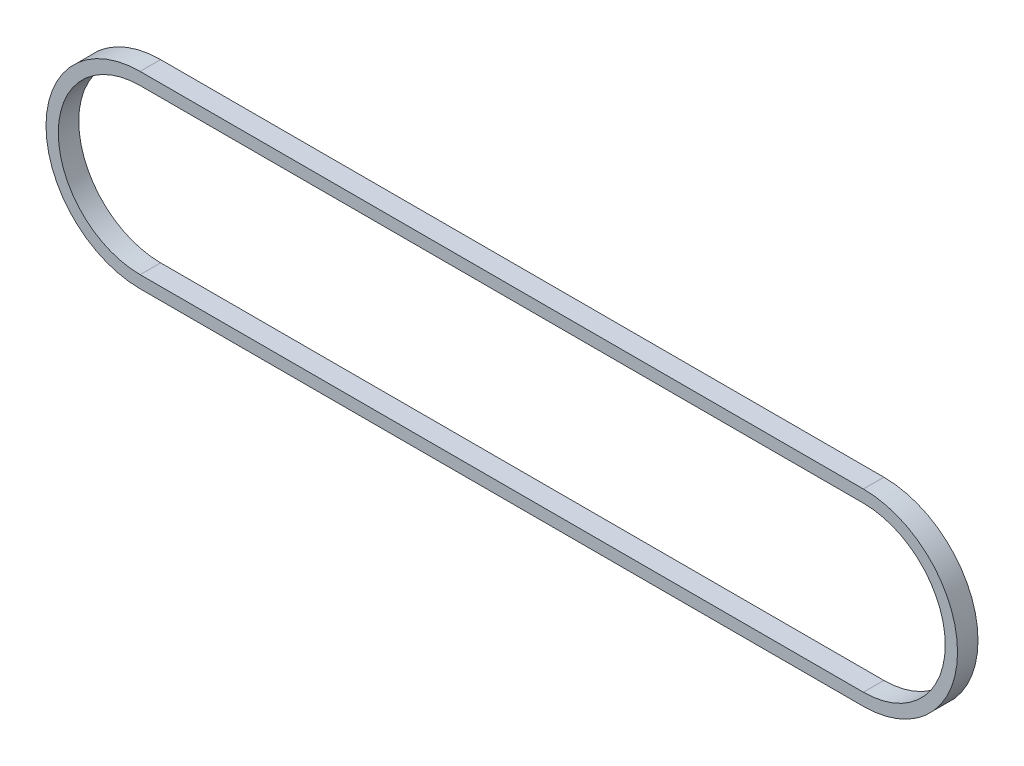
ISO-10303-21;
HEADER;
FILE_DESCRIPTION(('STEP AP214'),'2;1');
FILE_NAME('part.step','',(''),(''),'','','');
FILE_SCHEMA(('AUTOMOTIVE_DESIGN { 1 0 10303 214 1 1 1 1 }'));
ENDSEC;
DATA;
#1=APPLICATION_CONTEXT('core data for automotive mechanical design processes');
#2=APPLICATION_PROTOCOL_DEFINITION('international standard','automotive_design',2000,#1);
#3=PRODUCT_CONTEXT('',#1,'mechanical');
#4=PRODUCT('Part','Part','',(#3));
#5=PRODUCT_RELATED_PRODUCT_CATEGORY('part','',(#4));
#6=PRODUCT_DEFINITION_FORMATION('','',#4);
#7=PRODUCT_DEFINITION_CONTEXT('part definition',#1,'design');
#8=PRODUCT_DEFINITION('design','',#6,#7);
#9=PRODUCT_DEFINITION_SHAPE('','',#8);
#10=(LENGTH_UNIT() NAMED_UNIT(*) SI_UNIT(.MILLI.,.METRE.));
#11=(NAMED_UNIT(*) PLANE_ANGLE_UNIT() SI_UNIT($,.RADIAN.));
#12=(NAMED_UNIT(*) SI_UNIT($,.STERADIAN.) SOLID_ANGLE_UNIT());
#13=UNCERTAINTY_MEASURE_WITH_UNIT(LENGTH_MEASURE(1.E-05),#10,'distance_accuracy_value','');
#14=(GEOMETRIC_REPRESENTATION_CONTEXT(3) GLOBAL_UNCERTAINTY_ASSIGNED_CONTEXT((#13)) GLOBAL_UNIT_ASSIGNED_CONTEXT((#10,
#11,#12)) REPRESENTATION_CONTEXT('',''));
#15=CARTESIAN_POINT('',(0.,0.,0.));
#16=DIRECTION('',(0.,0.,1.));
#17=DIRECTION('',(1.,0.,0.));
#18=AXIS2_PLACEMENT_3D('',#15,#16,#17);
#19=CARTESIAN_POINT('',(88.35,0.,2.5));
#20=DIRECTION('',(0.,0.,1.));
#21=DIRECTION('',(1.,0.,0.));
#22=AXIS2_PLACEMENT_3D('',#19,#20,#21);
#23=PLANE('',#22);
#24=CARTESIAN_POINT('',(88.35,0.,2.5));
#25=DIRECTION('',(0.,0.,1.));
#26=DIRECTION('',(1.,0.,0.));
#27=AXIS2_PLACEMENT_3D('',#24,#25,#26);
#28=CIRCLE('',#27,23.);
#29=CARTESIAN_POINT('',(88.35,-23.,2.5));
#30=VERTEX_POINT('',#29);
#31=CARTESIAN_POINT('',(88.35,23.,2.5));
#32=VERTEX_POINT('',#31);
#33=EDGE_CURVE('E157',#30,#32,#28,.T.);
#34=ORIENTED_EDGE('',*,*,#33,.T.);
#35=DIRECTION('',(-1.,0.,0.));
#36=VECTOR('',#35,1.);
#37=CARTESIAN_POINT('',(88.35,23.,2.5));
#38=LINE('',#37,#36);
#39=CARTESIAN_POINT('',(-88.35,23.,2.5));
#40=VERTEX_POINT('',#39);
#41=EDGE_CURVE('E161',#32,#40,#38,.T.);
#42=ORIENTED_EDGE('',*,*,#41,.T.);
#43=CARTESIAN_POINT('',(-88.35,0.,2.5));
#44=DIRECTION('',(0.,0.,1.));
#45=DIRECTION('',(1.,0.,0.));
#46=AXIS2_PLACEMENT_3D('',#43,#44,#45);
#47=CIRCLE('',#46,23.);
#48=CARTESIAN_POINT('',(-88.35,-23.,2.5));
#49=VERTEX_POINT('',#48);
#50=EDGE_CURVE('E165',#40,#49,#47,.T.);
#51=ORIENTED_EDGE('',*,*,#50,.T.);
#52=DIRECTION('',(1.,0.,0.));
#53=VECTOR('',#52,1.);
#54=CARTESIAN_POINT('',(88.35,-23.,2.5));
#55=LINE('',#54,#53);
#56=EDGE_CURVE('E168',#49,#30,#55,.T.);
#57=ORIENTED_EDGE('',*,*,#56,.T.);
#58=EDGE_LOOP('',(#34,#42,#51,#57));
#59=FACE_BOUND('',#58,.T.);
#60=DIRECTION('',(-1.,0.,0.));
#61=VECTOR('',#60,1.);
#62=CARTESIAN_POINT('',(88.35,20.,2.5));
#63=LINE('',#62,#61);
#64=CARTESIAN_POINT('',(88.35,20.,2.5));
#65=VERTEX_POINT('',#64);
#66=CARTESIAN_POINT('',(-88.35,20.,2.5));
#67=VERTEX_POINT('',#66);
#68=EDGE_CURVE('E118',#65,#67,#63,.T.);
#69=ORIENTED_EDGE('',*,*,#68,.F.);
#70=CARTESIAN_POINT('',(88.35,0.,2.5));
#71=DIRECTION('',(0.,0.,1.));
#72=DIRECTION('',(1.,0.,0.));
#73=AXIS2_PLACEMENT_3D('',#70,#71,#72);
#74=CIRCLE('',#73,20.);
#75=CARTESIAN_POINT('',(88.35,-20.,2.5));
#76=VERTEX_POINT('',#75);
#77=EDGE_CURVE('E109',#76,#65,#74,.T.);
#78=ORIENTED_EDGE('',*,*,#77,.F.);
#79=DIRECTION('',(1.,0.,0.));
#80=VECTOR('',#79,1.);
#81=CARTESIAN_POINT('',(88.35,-20.,2.5));
#82=LINE('',#81,#80);
#83=CARTESIAN_POINT('',(-88.35,-20.,2.5));
#84=VERTEX_POINT('',#83);
#85=EDGE_CURVE('E135',#84,#76,#82,.T.);
#86=ORIENTED_EDGE('',*,*,#85,.F.);
#87=CARTESIAN_POINT('',(-88.35,0.,2.5));
#88=DIRECTION('',(0.,0.,1.));
#89=DIRECTION('',(1.,0.,0.));
#90=AXIS2_PLACEMENT_3D('',#87,#88,#89);
#91=CIRCLE('',#90,20.);
#92=EDGE_CURVE('E131',#67,#84,#91,.T.);
#93=ORIENTED_EDGE('',*,*,#92,.F.);
#94=EDGE_LOOP('',(#69,#78,#86,#93));
#95=FACE_BOUND('',#94,.T.);
#96=ADVANCED_FACE('F43',(#59,#95),#23,.T.);
#97=CARTESIAN_POINT('',(88.35,0.,-2.5));
#98=DIRECTION('',(0.,0.,1.));
#99=DIRECTION('',(1.,0.,0.));
#100=AXIS2_PLACEMENT_3D('',#97,#98,#99);
#101=PLANE('',#100);
#102=CARTESIAN_POINT('',(88.35,0.,-2.5));
#103=DIRECTION('',(0.,0.,1.));
#104=DIRECTION('',(1.,0.,0.));
#105=AXIS2_PLACEMENT_3D('',#102,#103,#104);
#106=CIRCLE('',#105,23.);
#107=CARTESIAN_POINT('',(88.35,-23.,-2.5));
#108=VERTEX_POINT('',#107);
#109=CARTESIAN_POINT('',(88.35,23.,-2.5));
#110=VERTEX_POINT('',#109);
#111=EDGE_CURVE('E127',#108,#110,#106,.T.);
#112=ORIENTED_EDGE('',*,*,#111,.F.);
#113=DIRECTION('',(1.,0.,0.));
#114=VECTOR('',#113,1.);
#115=CARTESIAN_POINT('',(88.35,-23.,-2.5));
#116=LINE('',#115,#114);
#117=CARTESIAN_POINT('',(-88.35,-23.,-2.5));
#118=VERTEX_POINT('',#117);
#119=EDGE_CURVE('E162',#118,#108,#116,.T.);
#120=ORIENTED_EDGE('',*,*,#119,.F.);
#121=CARTESIAN_POINT('',(-88.35,0.,-2.5));
#122=DIRECTION('',(0.,0.,1.));
#123=DIRECTION('',(1.,0.,0.));
#124=AXIS2_PLACEMENT_3D('',#121,#122,#123);
#125=CIRCLE('',#124,23.);
#126=CARTESIAN_POINT('',(-88.35,23.,-2.5));
#127=VERTEX_POINT('',#126);
#128=EDGE_CURVE('E178',#127,#118,#125,.T.);
#129=ORIENTED_EDGE('',*,*,#128,.F.);
#130=DIRECTION('',(-1.,0.,0.));
#131=VECTOR('',#130,1.);
#132=CARTESIAN_POINT('',(88.35,23.,-2.5));
#133=LINE('',#132,#131);
#134=EDGE_CURVE('E175',#110,#127,#133,.T.);
#135=ORIENTED_EDGE('',*,*,#134,.F.);
#136=EDGE_LOOP('',(#112,#120,#129,#135));
#137=FACE_BOUND('',#136,.T.);
#138=CARTESIAN_POINT('',(88.35,0.,-2.5));
#139=DIRECTION('',(0.,0.,1.));
#140=DIRECTION('',(1.,0.,0.));
#141=AXIS2_PLACEMENT_3D('',#138,#139,#140);
#142=CIRCLE('',#141,20.);
#143=CARTESIAN_POINT('',(88.35,-20.,-2.5));
#144=VERTEX_POINT('',#143);
#145=CARTESIAN_POINT('',(88.35,20.,-2.5));
#146=VERTEX_POINT('',#145);
#147=EDGE_CURVE('E67',#144,#146,#142,.T.);
#148=ORIENTED_EDGE('',*,*,#147,.T.);
#149=DIRECTION('',(-1.,0.,0.));
#150=VECTOR('',#149,1.);
#151=CARTESIAN_POINT('',(88.35,20.,-2.5));
#152=LINE('',#151,#150);
#153=CARTESIAN_POINT('',(-88.35,20.,-2.5));
#154=VERTEX_POINT('',#153);
#155=EDGE_CURVE('E125',#146,#154,#152,.T.);
#156=ORIENTED_EDGE('',*,*,#155,.T.);
#157=CARTESIAN_POINT('',(-88.35,0.,-2.5));
#158=DIRECTION('',(0.,0.,1.));
#159=DIRECTION('',(1.,0.,0.));
#160=AXIS2_PLACEMENT_3D('',#157,#158,#159);
#161=CIRCLE('',#160,20.);
#162=CARTESIAN_POINT('',(-88.35,-20.,-2.5));
#163=VERTEX_POINT('',#162);
#164=EDGE_CURVE('E144',#154,#163,#161,.T.);
#165=ORIENTED_EDGE('',*,*,#164,.T.);
#166=DIRECTION('',(1.,0.,0.));
#167=VECTOR('',#166,1.);
#168=CARTESIAN_POINT('',(88.35,-20.,-2.5));
#169=LINE('',#168,#167);
#170=EDGE_CURVE('E119',#163,#144,#169,.T.);
#171=ORIENTED_EDGE('',*,*,#170,.T.);
#172=EDGE_LOOP('',(#148,#156,#165,#171));
#173=FACE_BOUND('',#172,.T.);
#174=ADVANCED_FACE('F201',(#137,#173),#101,.F.);
#175=CARTESIAN_POINT('',(88.35,0.,2.5));
#176=DIRECTION('',(0.,0.,-1.));
#177=DIRECTION('',(-1.,0.,0.));
#178=AXIS2_PLACEMENT_3D('',#175,#176,#177);
#179=CYLINDRICAL_SURFACE('',#178,23.);
#180=ORIENTED_EDGE('',*,*,#111,.T.);
#181=DIRECTION('',(0.,0.,-1.));
#182=VECTOR('',#181,1.);
#183=CARTESIAN_POINT('',(88.35,23.,2.5));
#184=LINE('',#183,#182);
#185=EDGE_CURVE('E11',#32,#110,#184,.T.);
#186=ORIENTED_EDGE('',*,*,#185,.F.);
#187=ORIENTED_EDGE('',*,*,#33,.F.);
#188=DIRECTION('',(0.,0.,-1.));
#189=VECTOR('',#188,1.);
#190=CARTESIAN_POINT('',(88.35,-23.,2.5));
#191=LINE('',#190,#189);
#192=EDGE_CURVE('E171',#30,#108,#191,.T.);
#193=ORIENTED_EDGE('',*,*,#192,.T.);
#194=EDGE_LOOP('',(#180,#186,#187,#193));
#195=FACE_BOUND('',#194,.T.);
#196=ADVANCED_FACE('F45',(#195),#179,.T.);
#197=CARTESIAN_POINT('',(88.35,23.,2.5));
#198=DIRECTION('',(0.,-1.,0.));
#199=DIRECTION('',(1.,0.,0.));
#200=AXIS2_PLACEMENT_3D('',#197,#198,#199);
#201=PLANE('',#200);
#202=ORIENTED_EDGE('',*,*,#134,.T.);
#203=DIRECTION('',(0.,0.,-1.));
#204=VECTOR('',#203,1.);
#205=CARTESIAN_POINT('',(-88.35,23.,2.5));
#206=LINE('',#205,#204);
#207=EDGE_CURVE('E52',#40,#127,#206,.T.);
#208=ORIENTED_EDGE('',*,*,#207,.F.);
#209=ORIENTED_EDGE('',*,*,#41,.F.);
#210=ORIENTED_EDGE('',*,*,#185,.T.);
#211=EDGE_LOOP('',(#202,#208,#209,#210));
#212=FACE_BOUND('',#211,.T.);
#213=ADVANCED_FACE('F211',(#212),#201,.F.);
#214=CARTESIAN_POINT('',(-88.35,0.,2.5));
#215=DIRECTION('',(0.,0.,-1.));
#216=DIRECTION('',(-1.,0.,0.));
#217=AXIS2_PLACEMENT_3D('',#214,#215,#216);
#218=CYLINDRICAL_SURFACE('',#217,23.);
#219=ORIENTED_EDGE('',*,*,#128,.T.);
#220=DIRECTION('',(0.,0.,-1.));
#221=VECTOR('',#220,1.);
#222=CARTESIAN_POINT('',(-88.35,-23.,2.5));
#223=LINE('',#222,#221);
#224=EDGE_CURVE('E186',#49,#118,#223,.T.);
#225=ORIENTED_EDGE('',*,*,#224,.F.);
#226=ORIENTED_EDGE('',*,*,#50,.F.);
#227=ORIENTED_EDGE('',*,*,#207,.T.);
#228=EDGE_LOOP('',(#219,#225,#226,#227));
#229=FACE_BOUND('',#228,.T.);
#230=ADVANCED_FACE('F195',(#229),#218,.T.);
#231=CARTESIAN_POINT('',(88.35,-23.,2.5));
#232=DIRECTION('',(0.,1.,0.));
#233=DIRECTION('',(-1.,0.,0.));
#234=AXIS2_PLACEMENT_3D('',#231,#232,#233);
#235=PLANE('',#234);
#236=ORIENTED_EDGE('',*,*,#119,.T.);
#237=ORIENTED_EDGE('',*,*,#192,.F.);
#238=ORIENTED_EDGE('',*,*,#56,.F.);
#239=ORIENTED_EDGE('',*,*,#224,.T.);
#240=EDGE_LOOP('',(#236,#237,#238,#239));
#241=FACE_BOUND('',#240,.T.);
#242=ADVANCED_FACE('F205',(#241),#235,.F.);
#243=CARTESIAN_POINT('',(88.35,0.,2.5));
#244=DIRECTION('',(0.,0.,-1.));
#245=DIRECTION('',(-1.,0.,0.));
#246=AXIS2_PLACEMENT_3D('',#243,#244,#245);
#247=CYLINDRICAL_SURFACE('',#246,20.);
#248=ORIENTED_EDGE('',*,*,#147,.F.);
#249=DIRECTION('',(0.,0.,-1.));
#250=VECTOR('',#249,1.);
#251=CARTESIAN_POINT('',(88.35,-20.,2.5));
#252=LINE('',#251,#250);
#253=EDGE_CURVE('E113',#76,#144,#252,.T.);
#254=ORIENTED_EDGE('',*,*,#253,.F.);
#255=ORIENTED_EDGE('',*,*,#77,.T.);
#256=DIRECTION('',(0.,0.,-1.));
#257=VECTOR('',#256,1.);
#258=CARTESIAN_POINT('',(88.35,20.,2.5));
#259=LINE('',#258,#257);
#260=EDGE_CURVE('E112',#65,#146,#259,.T.);
#261=ORIENTED_EDGE('',*,*,#260,.T.);
#262=EDGE_LOOP('',(#248,#254,#255,#261));
#263=FACE_BOUND('',#262,.T.);
#264=ADVANCED_FACE('F111',(#263),#247,.F.);
#265=CARTESIAN_POINT('',(88.35,20.,2.5));
#266=DIRECTION('',(0.,-1.,0.));
#267=DIRECTION('',(1.,0.,0.));
#268=AXIS2_PLACEMENT_3D('',#265,#266,#267);
#269=PLANE('',#268);
#270=ORIENTED_EDGE('',*,*,#155,.F.);
#271=ORIENTED_EDGE('',*,*,#260,.F.);
#272=ORIENTED_EDGE('',*,*,#68,.T.);
#273=DIRECTION('',(0.,0.,-1.));
#274=VECTOR('',#273,1.);
#275=CARTESIAN_POINT('',(-88.35,20.,2.5));
#276=LINE('',#275,#274);
#277=EDGE_CURVE('E128',#67,#154,#276,.T.);
#278=ORIENTED_EDGE('',*,*,#277,.T.);
#279=EDGE_LOOP('',(#270,#271,#272,#278));
#280=FACE_BOUND('',#279,.T.);
#281=ADVANCED_FACE('F122',(#280),#269,.T.);
#282=CARTESIAN_POINT('',(-88.35,0.,2.5));
#283=DIRECTION('',(0.,0.,-1.));
#284=DIRECTION('',(-1.,0.,0.));
#285=AXIS2_PLACEMENT_3D('',#282,#283,#284);
#286=CYLINDRICAL_SURFACE('',#285,20.);
#287=ORIENTED_EDGE('',*,*,#164,.F.);
#288=ORIENTED_EDGE('',*,*,#277,.F.);
#289=ORIENTED_EDGE('',*,*,#92,.T.);
#290=DIRECTION('',(0.,0.,-1.));
#291=VECTOR('',#290,1.);
#292=CARTESIAN_POINT('',(-88.35,-20.,2.5));
#293=LINE('',#292,#291);
#294=EDGE_CURVE('E59',#84,#163,#293,.T.);
#295=ORIENTED_EDGE('',*,*,#294,.T.);
#296=EDGE_LOOP('',(#287,#288,#289,#295));
#297=FACE_BOUND('',#296,.T.);
#298=ADVANCED_FACE('F234',(#297),#286,.F.);
#299=CARTESIAN_POINT('',(88.35,-20.,2.5));
#300=DIRECTION('',(0.,1.,0.));
#301=DIRECTION('',(-1.,0.,0.));
#302=AXIS2_PLACEMENT_3D('',#299,#300,#301);
#303=PLANE('',#302);
#304=ORIENTED_EDGE('',*,*,#170,.F.);
#305=ORIENTED_EDGE('',*,*,#294,.F.);
#306=ORIENTED_EDGE('',*,*,#85,.T.);
#307=ORIENTED_EDGE('',*,*,#253,.T.);
#308=EDGE_LOOP('',(#304,#305,#306,#307));
#309=FACE_BOUND('',#308,.T.);
#310=ADVANCED_FACE('F238',(#309),#303,.T.);
#311=CLOSED_SHELL('',(#96,#174,#196,#213,#230,#242,#264,#281,#298,#310));
#312=MANIFOLD_SOLID_BREP('B2',#311);
#313=ADVANCED_BREP_SHAPE_REPRESENTATION('',(#18,#312),#14);
#314=SHAPE_DEFINITION_REPRESENTATION(#9,#313);
ENDSEC;
END-ISO-10303-21;
